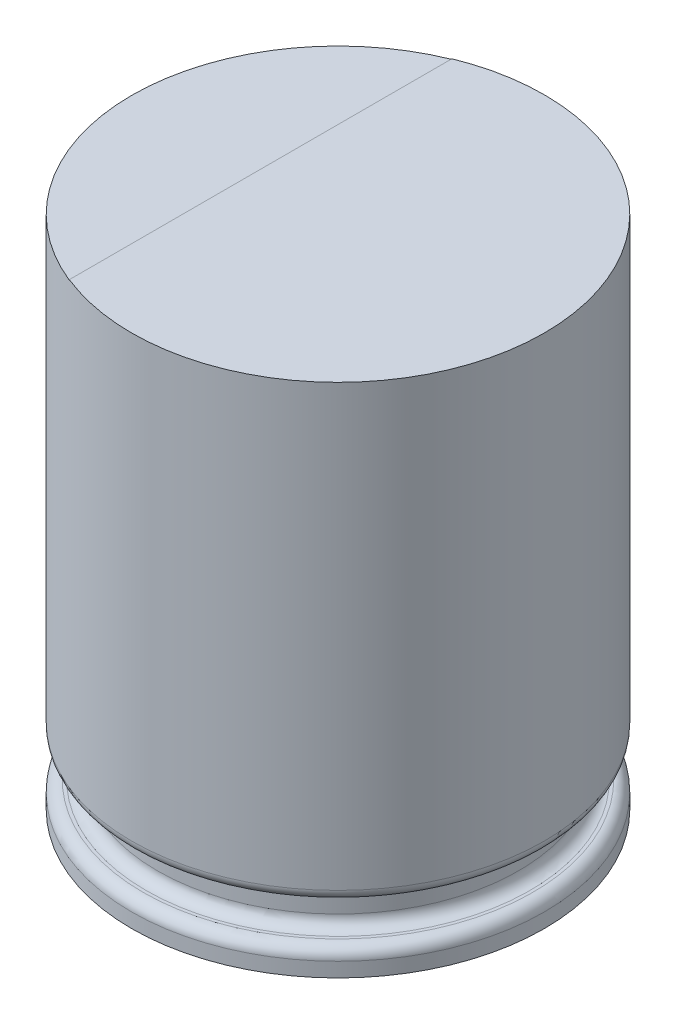
ISO-10303-21;
HEADER;
FILE_DESCRIPTION(('STEP AP214'),'2;1');
FILE_NAME('part.step','',(''),(''),'','','');
FILE_SCHEMA(('AUTOMOTIVE_DESIGN { 1 0 10303 214 1 1 1 1 }'));
ENDSEC;
DATA;
#1=APPLICATION_CONTEXT('core data for automotive mechanical design processes');
#2=APPLICATION_PROTOCOL_DEFINITION('international standard','automotive_design',2000,#1);
#3=PRODUCT_CONTEXT('',#1,'mechanical');
#4=PRODUCT('Part','Part','',(#3));
#5=PRODUCT_RELATED_PRODUCT_CATEGORY('part','',(#4));
#6=PRODUCT_DEFINITION_FORMATION('','',#4);
#7=PRODUCT_DEFINITION_CONTEXT('part definition',#1,'design');
#8=PRODUCT_DEFINITION('design','',#6,#7);
#9=PRODUCT_DEFINITION_SHAPE('','',#8);
#10=(LENGTH_UNIT() NAMED_UNIT(*) SI_UNIT(.MILLI.,.METRE.));
#11=(NAMED_UNIT(*) PLANE_ANGLE_UNIT() SI_UNIT($,.RADIAN.));
#12=(NAMED_UNIT(*) SI_UNIT($,.STERADIAN.) SOLID_ANGLE_UNIT());
#13=UNCERTAINTY_MEASURE_WITH_UNIT(LENGTH_MEASURE(1.E-05),#10,'distance_accuracy_value','');
#14=(GEOMETRIC_REPRESENTATION_CONTEXT(3) GLOBAL_UNCERTAINTY_ASSIGNED_CONTEXT((#13)) GLOBAL_UNIT_ASSIGNED_CONTEXT((#10,
#11,#12)) REPRESENTATION_CONTEXT('',''));
#15=CARTESIAN_POINT('',(0.,0.,0.));
#16=DIRECTION('',(0.,0.,1.));
#17=DIRECTION('',(1.,0.,0.));
#18=AXIS2_PLACEMENT_3D('',#15,#16,#17);
#19=CARTESIAN_POINT('',(4.,0.,0.));
#20=DIRECTION('',(0.,1.,0.));
#21=DIRECTION('',(0.,0.,1.));
#22=AXIS2_PLACEMENT_3D('',#19,#20,#21);
#23=PLANE('',#22);
#24=CARTESIAN_POINT('',(0.,0.,0.));
#25=DIRECTION('',(0.,1.,0.));
#26=DIRECTION('',(0.,0.,1.));
#27=AXIS2_PLACEMENT_3D('',#24,#25,#26);
#28=CIRCLE('',#27,4.);
#29=CARTESIAN_POINT('',(0.,0.,4.));
#30=VERTEX_POINT('',#29);
#31=EDGE_CURVE('E73',#30,#30,#28,.T.);
#32=ORIENTED_EDGE('',*,*,#31,.F.);
#33=EDGE_LOOP('',(#32));
#34=FACE_BOUND('',#33,.T.);
#35=ADVANCED_FACE('F34',(#34),#23,.F.);
#36=CARTESIAN_POINT('',(0.,10.,0.));
#37=DIRECTION('',(0.,-1.,0.));
#38=DIRECTION('',(0.,0.,-1.));
#39=AXIS2_PLACEMENT_3D('',#36,#37,#38);
#40=PLANE('',#39);
#41=CARTESIAN_POINT('',(0.,10.,0.));
#42=DIRECTION('',(0.,1.,0.));
#43=DIRECTION('',(0.,0.,1.));
#44=AXIS2_PLACEMENT_3D('',#41,#42,#43);
#45=CIRCLE('',#44,4.);
#46=CARTESIAN_POINT('',(-1.5,10.,3.70809924354783));
#47=VERTEX_POINT('',#46);
#48=CARTESIAN_POINT('',(-1.5,10.,-3.70809924354783));
#49=VERTEX_POINT('',#48);
#50=EDGE_CURVE('E11',#47,#49,#45,.T.);
#51=ORIENTED_EDGE('',*,*,#50,.T.);
#52=DIRECTION('',(0.,0.,-1.));
#53=VECTOR('',#52,1.);
#54=CARTESIAN_POINT('',(-1.5,10.,-3.70809924354783));
#55=LINE('',#54,#53);
#56=EDGE_CURVE('E62',#47,#49,#55,.T.);
#57=ORIENTED_EDGE('',*,*,#56,.F.);
#58=EDGE_LOOP('',(#51,#57));
#59=FACE_BOUND('',#58,.T.);
#60=ADVANCED_FACE('F69',(#59),#40,.F.);
#61=CARTESIAN_POINT('',(0.,10.,0.));
#62=DIRECTION('',(0.,1.,0.));
#63=DIRECTION('',(0.,0.,1.));
#64=AXIS2_PLACEMENT_3D('',#61,#62,#63);
#65=CYLINDRICAL_SURFACE('',#64,4.);
#66=CARTESIAN_POINT('',(0.,9.99,0.));
#67=DIRECTION('',(0.,1.,0.));
#68=DIRECTION('',(0.,0.,1.));
#69=AXIS2_PLACEMENT_3D('',#66,#67,#68);
#70=CIRCLE('',#69,4.);
#71=CARTESIAN_POINT('',(-1.5,9.99,-3.70809924354783));
#72=VERTEX_POINT('',#71);
#73=CARTESIAN_POINT('',(-1.5,9.99,3.70809924354783));
#74=VERTEX_POINT('',#73);
#75=EDGE_CURVE('E52',#72,#74,#70,.T.);
#76=ORIENTED_EDGE('',*,*,#75,.F.);
#77=DIRECTION('',(0.,1.,0.));
#78=VECTOR('',#77,1.);
#79=CARTESIAN_POINT('',(-1.5,9.99,-3.70809924354783));
#80=LINE('',#79,#78);
#81=EDGE_CURVE('E66',#72,#49,#80,.T.);
#82=ORIENTED_EDGE('',*,*,#81,.T.);
#83=ORIENTED_EDGE('',*,*,#50,.F.);
#84=DIRECTION('',(0.,1.,0.));
#85=VECTOR('',#84,1.);
#86=CARTESIAN_POINT('',(-1.5,9.99,3.70809924354783));
#87=LINE('',#86,#85);
#88=EDGE_CURVE('E59',#74,#47,#87,.T.);
#89=ORIENTED_EDGE('',*,*,#88,.F.);
#90=EDGE_LOOP('',(#76,#82,#83,#89));
#91=FACE_BOUND('',#90,.T.);
#92=CARTESIAN_POINT('',(0.,1.47,0.));
#93=DIRECTION('',(0.,1.,0.));
#94=DIRECTION('',(0.,0.,1.));
#95=AXIS2_PLACEMENT_3D('',#92,#93,#94);
#96=CIRCLE('',#95,4.);
#97=CARTESIAN_POINT('',(0.,1.47,4.));
#98=VERTEX_POINT('',#97);
#99=EDGE_CURVE('E41',#98,#98,#96,.T.);
#100=ORIENTED_EDGE('',*,*,#99,.T.);
#101=EDGE_LOOP('',(#100));
#102=FACE_BOUND('',#101,.T.);
#103=ADVANCED_FACE('F71',(#91,#102),#65,.T.);
#104=CARTESIAN_POINT('',(0.,1.47,0.));
#105=DIRECTION('',(0.,1.,0.));
#106=DIRECTION('',(0.,0.,1.));
#107=AXIS2_PLACEMENT_3D('',#104,#105,#106);
#108=TOROIDAL_SURFACE('',#107,3.78,0.22);
#109=ORIENTED_EDGE('',*,*,#99,.F.);
#110=EDGE_LOOP('',(#109));
#111=FACE_BOUND('',#110,.T.);
#112=CARTESIAN_POINT('',(0.,1.25,0.));
#113=DIRECTION('',(0.,1.,0.));
#114=DIRECTION('',(0.,0.,1.));
#115=AXIS2_PLACEMENT_3D('',#112,#113,#114);
#116=CIRCLE('',#115,3.78);
#117=CARTESIAN_POINT('',(0.,1.25,3.78));
#118=VERTEX_POINT('',#117);
#119=EDGE_CURVE('E97',#118,#118,#116,.T.);
#120=ORIENTED_EDGE('',*,*,#119,.T.);
#121=EDGE_LOOP('',(#120));
#122=FACE_BOUND('',#121,.T.);
#123=ADVANCED_FACE('F102',(#111,#122),#108,.T.);
#124=CARTESIAN_POINT('',(3.78,1.25,0.));
#125=DIRECTION('',(0.,1.,0.));
#126=DIRECTION('',(0.,0.,1.));
#127=AXIS2_PLACEMENT_3D('',#124,#125,#126);
#128=PLANE('',#127);
#129=ORIENTED_EDGE('',*,*,#119,.F.);
#130=EDGE_LOOP('',(#129));
#131=FACE_BOUND('',#130,.T.);
#132=CARTESIAN_POINT('',(0.,1.25,0.));
#133=DIRECTION('',(0.,1.,0.));
#134=DIRECTION('',(0.,0.,1.));
#135=AXIS2_PLACEMENT_3D('',#132,#133,#134);
#136=CIRCLE('',#135,3.72);
#137=CARTESIAN_POINT('',(0.,1.25,3.72));
#138=VERTEX_POINT('',#137);
#139=EDGE_CURVE('E94',#138,#138,#136,.T.);
#140=ORIENTED_EDGE('',*,*,#139,.T.);
#141=EDGE_LOOP('',(#140));
#142=FACE_BOUND('',#141,.T.);
#143=ADVANCED_FACE('F105',(#131,#142),#128,.F.);
#144=CARTESIAN_POINT('',(0.,1.03,0.));
#145=DIRECTION('',(0.,1.,0.));
#146=DIRECTION('',(0.,0.,1.));
#147=AXIS2_PLACEMENT_3D('',#144,#145,#146);
#148=TOROIDAL_SURFACE('',#147,3.72,0.22);
#149=ORIENTED_EDGE('',*,*,#139,.F.);
#150=EDGE_LOOP('',(#149));
#151=FACE_BOUND('',#150,.T.);
#152=CARTESIAN_POINT('',(0.,1.03,0.));
#153=DIRECTION('',(0.,1.,0.));
#154=DIRECTION('',(0.,0.,1.));
#155=AXIS2_PLACEMENT_3D('',#152,#153,#154);
#156=CIRCLE('',#155,3.5);
#157=CARTESIAN_POINT('',(0.,1.03,3.5));
#158=VERTEX_POINT('',#157);
#159=EDGE_CURVE('E91',#158,#158,#156,.T.);
#160=ORIENTED_EDGE('',*,*,#159,.T.);
#161=EDGE_LOOP('',(#160));
#162=FACE_BOUND('',#161,.T.);
#163=ADVANCED_FACE('F111',(#151,#162),#148,.F.);
#164=CARTESIAN_POINT('',(0.,10.,0.));
#165=DIRECTION('',(0.,1.,0.));
#166=DIRECTION('',(0.,0.,1.));
#167=AXIS2_PLACEMENT_3D('',#164,#165,#166);
#168=CYLINDRICAL_SURFACE('',#167,3.5);
#169=ORIENTED_EDGE('',*,*,#159,.F.);
#170=EDGE_LOOP('',(#169));
#171=FACE_BOUND('',#170,.T.);
#172=CARTESIAN_POINT('',(0.,0.72,0.));
#173=DIRECTION('',(0.,1.,0.));
#174=DIRECTION('',(0.,0.,1.));
#175=AXIS2_PLACEMENT_3D('',#172,#173,#174);
#176=CIRCLE('',#175,3.5);
#177=CARTESIAN_POINT('',(0.,0.72,3.5));
#178=VERTEX_POINT('',#177);
#179=EDGE_CURVE('E88',#178,#178,#176,.T.);
#180=ORIENTED_EDGE('',*,*,#179,.T.);
#181=EDGE_LOOP('',(#180));
#182=FACE_BOUND('',#181,.T.);
#183=ADVANCED_FACE('F117',(#171,#182),#168,.T.);
#184=CARTESIAN_POINT('',(0.,0.72,0.));
#185=DIRECTION('',(0.,1.,0.));
#186=DIRECTION('',(0.,0.,1.));
#187=AXIS2_PLACEMENT_3D('',#184,#185,#186);
#188=TOROIDAL_SURFACE('',#187,3.72,0.22);
#189=ORIENTED_EDGE('',*,*,#179,.F.);
#190=EDGE_LOOP('',(#189));
#191=FACE_BOUND('',#190,.T.);
#192=CARTESIAN_POINT('',(0.,0.499999999999999,0.));
#193=DIRECTION('',(0.,1.,0.));
#194=DIRECTION('',(0.,0.,1.));
#195=AXIS2_PLACEMENT_3D('',#192,#193,#194);
#196=CIRCLE('',#195,3.72);
#197=CARTESIAN_POINT('',(0.,0.499999999999999,3.72));
#198=VERTEX_POINT('',#197);
#199=EDGE_CURVE('E85',#198,#198,#196,.T.);
#200=ORIENTED_EDGE('',*,*,#199,.T.);
#201=EDGE_LOOP('',(#200));
#202=FACE_BOUND('',#201,.T.);
#203=ADVANCED_FACE('F123',(#191,#202),#188,.F.);
#204=CARTESIAN_POINT('',(3.72,0.5,0.));
#205=DIRECTION('',(0.,-1.,0.));
#206=DIRECTION('',(0.,0.,-1.));
#207=AXIS2_PLACEMENT_3D('',#204,#205,#206);
#208=PLANE('',#207);
#209=ORIENTED_EDGE('',*,*,#199,.F.);
#210=EDGE_LOOP('',(#209));
#211=FACE_BOUND('',#210,.T.);
#212=CARTESIAN_POINT('',(0.,0.5,0.));
#213=DIRECTION('',(0.,1.,0.));
#214=DIRECTION('',(0.,0.,1.));
#215=AXIS2_PLACEMENT_3D('',#212,#213,#214);
#216=CIRCLE('',#215,3.78);
#217=CARTESIAN_POINT('',(0.,0.5,3.78));
#218=VERTEX_POINT('',#217);
#219=EDGE_CURVE('E82',#218,#218,#216,.T.);
#220=ORIENTED_EDGE('',*,*,#219,.T.);
#221=EDGE_LOOP('',(#220));
#222=FACE_BOUND('',#221,.T.);
#223=ADVANCED_FACE('F129',(#211,#222),#208,.F.);
#224=CARTESIAN_POINT('',(0.,0.28,0.));
#225=DIRECTION('',(0.,1.,0.));
#226=DIRECTION('',(0.,0.,1.));
#227=AXIS2_PLACEMENT_3D('',#224,#225,#226);
#228=TOROIDAL_SURFACE('',#227,3.78,0.220000000000001);
#229=ORIENTED_EDGE('',*,*,#219,.F.);
#230=EDGE_LOOP('',(#229));
#231=FACE_BOUND('',#230,.T.);
#232=CARTESIAN_POINT('',(0.,0.280000000000001,0.));
#233=DIRECTION('',(0.,1.,0.));
#234=DIRECTION('',(0.,0.,1.));
#235=AXIS2_PLACEMENT_3D('',#232,#233,#234);
#236=CIRCLE('',#235,4.);
#237=CARTESIAN_POINT('',(0.,0.280000000000001,4.));
#238=VERTEX_POINT('',#237);
#239=EDGE_CURVE('E76',#238,#238,#236,.T.);
#240=ORIENTED_EDGE('',*,*,#239,.T.);
#241=EDGE_LOOP('',(#240));
#242=FACE_BOUND('',#241,.T.);
#243=ADVANCED_FACE('F135',(#231,#242),#228,.T.);
#244=CARTESIAN_POINT('',(0.,10.,0.));
#245=DIRECTION('',(0.,1.,0.));
#246=DIRECTION('',(0.,0.,1.));
#247=AXIS2_PLACEMENT_3D('',#244,#245,#246);
#248=CYLINDRICAL_SURFACE('',#247,4.);
#249=ORIENTED_EDGE('',*,*,#239,.F.);
#250=EDGE_LOOP('',(#249));
#251=FACE_BOUND('',#250,.T.);
#252=ORIENTED_EDGE('',*,*,#31,.T.);
#253=EDGE_LOOP('',(#252));
#254=FACE_BOUND('',#253,.T.);
#255=ADVANCED_FACE('F141',(#251,#254),#248,.T.);
#256=CARTESIAN_POINT('',(-1.5,9.99,-3.70809924354783));
#257=DIRECTION('',(1.,0.,0.));
#258=DIRECTION('',(0.,0.,-1.));
#259=AXIS2_PLACEMENT_3D('',#256,#257,#258);
#260=PLANE('',#259);
#261=ORIENTED_EDGE('',*,*,#56,.T.);
#262=ORIENTED_EDGE('',*,*,#81,.F.);
#263=DIRECTION('',(0.,0.,-1.));
#264=VECTOR('',#263,1.);
#265=CARTESIAN_POINT('',(-1.5,9.99,-3.70809924354783));
#266=LINE('',#265,#264);
#267=EDGE_CURVE('E47',#74,#72,#266,.T.);
#268=ORIENTED_EDGE('',*,*,#267,.F.);
#269=ORIENTED_EDGE('',*,*,#88,.T.);
#270=EDGE_LOOP('',(#261,#262,#268,#269));
#271=FACE_BOUND('',#270,.T.);
#272=ADVANCED_FACE('F61',(#271),#260,.F.);
#273=CARTESIAN_POINT('',(0.,9.99,0.));
#274=DIRECTION('',(0.,1.,0.));
#275=DIRECTION('',(0.,0.,1.));
#276=AXIS2_PLACEMENT_3D('',#273,#274,#275);
#277=PLANE('',#276);
#278=ORIENTED_EDGE('',*,*,#75,.T.);
#279=ORIENTED_EDGE('',*,*,#267,.T.);
#280=EDGE_LOOP('',(#278,#279));
#281=FACE_BOUND('',#280,.T.);
#282=ADVANCED_FACE('F161',(#281),#277,.T.);
#283=CLOSED_SHELL('',(#35,#60,#103,#123,#143,#163,#183,#203,#223,#243,#255,#272,#282));
#284=MANIFOLD_SOLID_BREP('B2',#283);
#285=ADVANCED_BREP_SHAPE_REPRESENTATION('',(#18,#284),#14);
#286=SHAPE_DEFINITION_REPRESENTATION(#9,#285);
ENDSEC;
END-ISO-10303-21;
